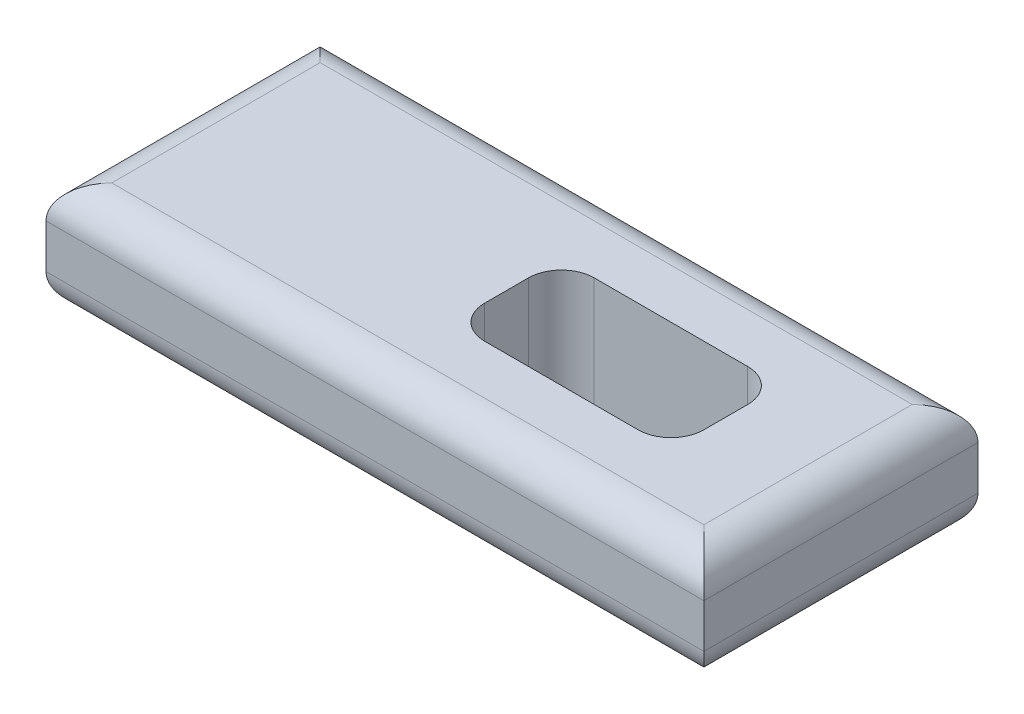
ISO-10303-21;
HEADER;
FILE_DESCRIPTION(('STEP AP214'),'2;1');
FILE_NAME('part.step','',(''),(''),'','','');
FILE_SCHEMA(('AUTOMOTIVE_DESIGN { 1 0 10303 214 1 1 1 1 }'));
ENDSEC;
DATA;
#1=APPLICATION_CONTEXT('core data for automotive mechanical design processes');
#2=APPLICATION_PROTOCOL_DEFINITION('international standard','automotive_design',2000,#1);
#3=PRODUCT_CONTEXT('',#1,'mechanical');
#4=PRODUCT('Part','Part','',(#3));
#5=PRODUCT_RELATED_PRODUCT_CATEGORY('part','',(#4));
#6=PRODUCT_DEFINITION_FORMATION('','',#4);
#7=PRODUCT_DEFINITION_CONTEXT('part definition',#1,'design');
#8=PRODUCT_DEFINITION('design','',#6,#7);
#9=PRODUCT_DEFINITION_SHAPE('','',#8);
#10=(LENGTH_UNIT() NAMED_UNIT(*) SI_UNIT(.MILLI.,.METRE.));
#11=(NAMED_UNIT(*) PLANE_ANGLE_UNIT() SI_UNIT($,.RADIAN.));
#12=(NAMED_UNIT(*) SI_UNIT($,.STERADIAN.) SOLID_ANGLE_UNIT());
#13=UNCERTAINTY_MEASURE_WITH_UNIT(LENGTH_MEASURE(1.E-05),#10,'distance_accuracy_value','');
#14=(GEOMETRIC_REPRESENTATION_CONTEXT(3) GLOBAL_UNCERTAINTY_ASSIGNED_CONTEXT((#13)) GLOBAL_UNIT_ASSIGNED_CONTEXT((#10,
#11,#12)) REPRESENTATION_CONTEXT('',''));
#15=CARTESIAN_POINT('',(0.,0.,0.));
#16=DIRECTION('',(0.,0.,1.));
#17=DIRECTION('',(1.,0.,0.));
#18=AXIS2_PLACEMENT_3D('',#15,#16,#17);
#19=CARTESIAN_POINT('',(0.,20.,0.));
#20=DIRECTION('',(1.,0.,0.));
#21=DIRECTION('',(0.,0.,-1.));
#22=AXIS2_PLACEMENT_3D('',#19,#20,#21);
#23=PLANE('',#22);
#24=DIRECTION('',(0.,-1.,0.));
#25=VECTOR('',#24,1.);
#26=CARTESIAN_POINT('',(0.,20.,-50.));
#27=LINE('',#26,#25);
#28=CARTESIAN_POINT('',(0.,14.,-50.));
#29=VERTEX_POINT('',#28);
#30=CARTESIAN_POINT('',(0.,6.,-50.));
#31=VERTEX_POINT('',#30);
#32=EDGE_CURVE('E156',#29,#31,#27,.T.);
#33=ORIENTED_EDGE('',*,*,#32,.T.);
#34=DIRECTION('',(0.,0.,1.));
#35=VECTOR('',#34,1.);
#36=CARTESIAN_POINT('',(0.,6.,0.));
#37=LINE('',#36,#35);
#38=CARTESIAN_POINT('',(0.,6.,0.));
#39=VERTEX_POINT('',#38);
#40=EDGE_CURVE('E164',#31,#39,#37,.T.);
#41=ORIENTED_EDGE('',*,*,#40,.T.);
#42=DIRECTION('',(0.,-1.,0.));
#43=VECTOR('',#42,1.);
#44=CARTESIAN_POINT('',(0.,20.,0.));
#45=LINE('',#44,#43);
#46=CARTESIAN_POINT('',(0.,14.,0.));
#47=VERTEX_POINT('',#46);
#48=EDGE_CURVE('E158',#47,#39,#45,.T.);
#49=ORIENTED_EDGE('',*,*,#48,.F.);
#50=DIRECTION('',(0.,0.,1.));
#51=VECTOR('',#50,1.);
#52=CARTESIAN_POINT('',(0.,14.,0.));
#53=LINE('',#52,#51);
#54=EDGE_CURVE('E154',#47,#29,#53,.F.);
#55=ORIENTED_EDGE('',*,*,#54,.T.);
#56=EDGE_LOOP('',(#33,#41,#49,#55));
#57=FACE_BOUND('',#56,.T.);
#58=ADVANCED_FACE('F39',(#57),#23,.F.);
#59=CARTESIAN_POINT('',(0.,20.,0.));
#60=DIRECTION('',(0.,0.,-1.));
#61=DIRECTION('',(-1.,0.,0.));
#62=AXIS2_PLACEMENT_3D('',#59,#60,#61);
#63=PLANE('',#62);
#64=ORIENTED_EDGE('',*,*,#48,.T.);
#65=DIRECTION('',(1.,0.,0.));
#66=VECTOR('',#65,1.);
#67=CARTESIAN_POINT('',(120.,6.,0.));
#68=LINE('',#67,#66);
#69=CARTESIAN_POINT('',(120.,6.,0.));
#70=VERTEX_POINT('',#69);
#71=EDGE_CURVE('E227',#39,#70,#68,.T.);
#72=ORIENTED_EDGE('',*,*,#71,.T.);
#73=DIRECTION('',(0.,-1.,0.));
#74=VECTOR('',#73,1.);
#75=CARTESIAN_POINT('',(120.,20.,0.));
#76=LINE('',#75,#74);
#77=CARTESIAN_POINT('',(120.,14.,0.));
#78=VERTEX_POINT('',#77);
#79=EDGE_CURVE('E200',#78,#70,#76,.T.);
#80=ORIENTED_EDGE('',*,*,#79,.F.);
#81=DIRECTION('',(1.,0.,0.));
#82=VECTOR('',#81,1.);
#83=CARTESIAN_POINT('',(0.,14.,0.));
#84=LINE('',#83,#82);
#85=EDGE_CURVE('E224',#78,#47,#84,.F.);
#86=ORIENTED_EDGE('',*,*,#85,.T.);
#87=EDGE_LOOP('',(#64,#72,#80,#86));
#88=FACE_BOUND('',#87,.T.);
#89=ADVANCED_FACE('F373',(#88),#63,.F.);
#90=CARTESIAN_POINT('',(120.,20.,0.));
#91=DIRECTION('',(-1.,0.,0.));
#92=DIRECTION('',(0.,0.,1.));
#93=AXIS2_PLACEMENT_3D('',#90,#91,#92);
#94=PLANE('',#93);
#95=ORIENTED_EDGE('',*,*,#79,.T.);
#96=DIRECTION('',(0.,0.,-1.));
#97=VECTOR('',#96,1.);
#98=CARTESIAN_POINT('',(120.,6.,-50.));
#99=LINE('',#98,#97);
#100=CARTESIAN_POINT('',(120.,6.,-50.));
#101=VERTEX_POINT('',#100);
#102=EDGE_CURVE('E221',#70,#101,#99,.T.);
#103=ORIENTED_EDGE('',*,*,#102,.T.);
#104=DIRECTION('',(0.,-1.,0.));
#105=VECTOR('',#104,1.);
#106=CARTESIAN_POINT('',(120.,20.,-50.));
#107=LINE('',#106,#105);
#108=CARTESIAN_POINT('',(120.,14.,-50.));
#109=VERTEX_POINT('',#108);
#110=EDGE_CURVE('E177',#109,#101,#107,.T.);
#111=ORIENTED_EDGE('',*,*,#110,.F.);
#112=DIRECTION('',(0.,0.,-1.));
#113=VECTOR('',#112,1.);
#114=CARTESIAN_POINT('',(120.,14.,0.));
#115=LINE('',#114,#113);
#116=EDGE_CURVE('E217',#109,#78,#115,.F.);
#117=ORIENTED_EDGE('',*,*,#116,.T.);
#118=EDGE_LOOP('',(#95,#103,#111,#117));
#119=FACE_BOUND('',#118,.T.);
#120=ADVANCED_FACE('F352',(#119),#94,.F.);
#121=CARTESIAN_POINT('',(0.,20.,-50.));
#122=DIRECTION('',(0.,0.,1.));
#123=DIRECTION('',(1.,0.,0.));
#124=AXIS2_PLACEMENT_3D('',#121,#122,#123);
#125=PLANE('',#124);
#126=ORIENTED_EDGE('',*,*,#110,.T.);
#127=DIRECTION('',(-1.,0.,0.));
#128=VECTOR('',#127,1.);
#129=CARTESIAN_POINT('',(0.,6.,-50.));
#130=LINE('',#129,#128);
#131=EDGE_CURVE('E175',#101,#31,#130,.T.);
#132=ORIENTED_EDGE('',*,*,#131,.T.);
#133=ORIENTED_EDGE('',*,*,#32,.F.);
#134=DIRECTION('',(-1.,0.,0.));
#135=VECTOR('',#134,1.);
#136=CARTESIAN_POINT('',(0.,14.,-50.));
#137=LINE('',#136,#135);
#138=EDGE_CURVE('E172',#29,#109,#137,.F.);
#139=ORIENTED_EDGE('',*,*,#138,.T.);
#140=EDGE_LOOP('',(#126,#132,#133,#139));
#141=FACE_BOUND('',#140,.T.);
#142=ADVANCED_FACE('F170',(#141),#125,.F.);
#143=CARTESIAN_POINT('',(0.,20.,0.));
#144=DIRECTION('',(0.,-1.,0.));
#145=DIRECTION('',(0.,0.,-1.));
#146=AXIS2_PLACEMENT_3D('',#143,#144,#145);
#147=PLANE('',#146);
#148=DIRECTION('',(1.,0.,0.));
#149=VECTOR('',#148,1.);
#150=CARTESIAN_POINT('',(59.,20.,-15.));
#151=LINE('',#150,#149);
#152=CARTESIAN_POINT('',(65.,20.,-15.));
#153=VERTEX_POINT('',#152);
#154=CARTESIAN_POINT('',(93.,20.,-15.));
#155=VERTEX_POINT('',#154);
#156=EDGE_CURVE('E324',#153,#155,#151,.T.);
#157=ORIENTED_EDGE('',*,*,#156,.F.);
#158=CARTESIAN_POINT('',(65.,20.,-21.));
#159=DIRECTION('',(0.,-1.,0.));
#160=DIRECTION('',(0.,0.,-1.));
#161=AXIS2_PLACEMENT_3D('',#158,#159,#160);
#162=CIRCLE('',#161,6.);
#163=CARTESIAN_POINT('',(59.,20.,-21.));
#164=VERTEX_POINT('',#163);
#165=EDGE_CURVE('E295',#153,#164,#162,.T.);
#166=ORIENTED_EDGE('',*,*,#165,.T.);
#167=DIRECTION('',(0.,0.,1.));
#168=VECTOR('',#167,1.);
#169=CARTESIAN_POINT('',(59.,20.,-35.));
#170=LINE('',#169,#168);
#171=CARTESIAN_POINT('',(59.,20.,-29.));
#172=VERTEX_POINT('',#171);
#173=EDGE_CURVE('E336',#172,#164,#170,.T.);
#174=ORIENTED_EDGE('',*,*,#173,.F.);
#175=CARTESIAN_POINT('',(65.,20.,-29.));
#176=DIRECTION('',(0.,-1.,0.));
#177=DIRECTION('',(0.,0.,-1.));
#178=AXIS2_PLACEMENT_3D('',#175,#176,#177);
#179=CIRCLE('',#178,6.);
#180=CARTESIAN_POINT('',(65.,20.,-35.));
#181=VERTEX_POINT('',#180);
#182=EDGE_CURVE('E301',#172,#181,#179,.T.);
#183=ORIENTED_EDGE('',*,*,#182,.T.);
#184=DIRECTION('',(-1.,0.,0.));
#185=VECTOR('',#184,1.);
#186=CARTESIAN_POINT('',(59.,20.,-35.));
#187=LINE('',#186,#185);
#188=CARTESIAN_POINT('',(93.,20.,-35.));
#189=VERTEX_POINT('',#188);
#190=EDGE_CURVE('E315',#189,#181,#187,.T.);
#191=ORIENTED_EDGE('',*,*,#190,.F.);
#192=CARTESIAN_POINT('',(93.,20.,-29.));
#193=DIRECTION('',(0.,-1.,0.));
#194=DIRECTION('',(0.,0.,-1.));
#195=AXIS2_PLACEMENT_3D('',#192,#193,#194);
#196=CIRCLE('',#195,6.);
#197=CARTESIAN_POINT('',(99.,20.,-29.));
#198=VERTEX_POINT('',#197);
#199=EDGE_CURVE('E48',#189,#198,#196,.T.);
#200=ORIENTED_EDGE('',*,*,#199,.T.);
#201=DIRECTION('',(0.,0.,-1.));
#202=VECTOR('',#201,1.);
#203=CARTESIAN_POINT('',(99.,20.,-35.));
#204=LINE('',#203,#202);
#205=CARTESIAN_POINT('',(99.,20.,-21.));
#206=VERTEX_POINT('',#205);
#207=EDGE_CURVE('E314',#206,#198,#204,.T.);
#208=ORIENTED_EDGE('',*,*,#207,.F.);
#209=CARTESIAN_POINT('',(93.,20.,-21.));
#210=DIRECTION('',(0.,-1.,0.));
#211=DIRECTION('',(0.,0.,-1.));
#212=AXIS2_PLACEMENT_3D('',#209,#210,#211);
#213=CIRCLE('',#212,6.);
#214=EDGE_CURVE('E289',#206,#155,#213,.T.);
#215=ORIENTED_EDGE('',*,*,#214,.T.);
#216=EDGE_LOOP('',(#157,#166,#174,#183,#191,#200,#208,#215));
#217=FACE_BOUND('',#216,.T.);
#218=DIRECTION('',(0.,0.,-1.));
#219=VECTOR('',#218,1.);
#220=CARTESIAN_POINT('',(114.,20.,0.));
#221=LINE('',#220,#219);
#222=CARTESIAN_POINT('',(114.,20.,-6.));
#223=VERTEX_POINT('',#222);
#224=CARTESIAN_POINT('',(114.,20.,-44.));
#225=VERTEX_POINT('',#224);
#226=EDGE_CURVE('E235',#223,#225,#221,.T.);
#227=ORIENTED_EDGE('',*,*,#226,.T.);
#228=DIRECTION('',(-1.,0.,0.));
#229=VECTOR('',#228,1.);
#230=CARTESIAN_POINT('',(0.,20.,-44.));
#231=LINE('',#230,#229);
#232=CARTESIAN_POINT('',(6.,20.,-44.));
#233=VERTEX_POINT('',#232);
#234=EDGE_CURVE('E239',#225,#233,#231,.T.);
#235=ORIENTED_EDGE('',*,*,#234,.T.);
#236=DIRECTION('',(0.,0.,1.));
#237=VECTOR('',#236,1.);
#238=CARTESIAN_POINT('',(6.,20.,0.));
#239=LINE('',#238,#237);
#240=CARTESIAN_POINT('',(6.,20.,-6.));
#241=VERTEX_POINT('',#240);
#242=EDGE_CURVE('E184',#233,#241,#239,.T.);
#243=ORIENTED_EDGE('',*,*,#242,.T.);
#244=DIRECTION('',(1.,0.,0.));
#245=VECTOR('',#244,1.);
#246=CARTESIAN_POINT('',(0.,20.,-6.));
#247=LINE('',#246,#245);
#248=EDGE_CURVE('E230',#241,#223,#247,.T.);
#249=ORIENTED_EDGE('',*,*,#248,.T.);
#250=EDGE_LOOP('',(#227,#235,#243,#249));
#251=FACE_BOUND('',#250,.T.);
#252=ADVANCED_FACE('F312',(#217,#251),#147,.F.);
#253=CARTESIAN_POINT('',(0.,0.,0.));
#254=DIRECTION('',(0.,-1.,0.));
#255=DIRECTION('',(0.,0.,-1.));
#256=AXIS2_PLACEMENT_3D('',#253,#254,#255);
#257=PLANE('',#256);
#258=DIRECTION('',(-1.,0.,0.));
#259=VECTOR('',#258,1.);
#260=CARTESIAN_POINT('',(59.,0.,-35.));
#261=LINE('',#260,#259);
#262=CARTESIAN_POINT('',(93.,0.,-35.));
#263=VERTEX_POINT('',#262);
#264=CARTESIAN_POINT('',(65.,0.,-35.));
#265=VERTEX_POINT('',#264);
#266=EDGE_CURVE('E258',#263,#265,#261,.T.);
#267=ORIENTED_EDGE('',*,*,#266,.T.);
#268=CARTESIAN_POINT('',(65.,0.,-29.));
#269=DIRECTION('',(0.,-1.,0.));
#270=DIRECTION('',(0.,0.,-1.));
#271=AXIS2_PLACEMENT_3D('',#268,#269,#270);
#272=CIRCLE('',#271,6.);
#273=CARTESIAN_POINT('',(59.,0.,-29.));
#274=VERTEX_POINT('',#273);
#275=EDGE_CURVE('E304',#265,#274,#272,.F.);
#276=ORIENTED_EDGE('',*,*,#275,.T.);
#277=DIRECTION('',(0.,0.,1.));
#278=VECTOR('',#277,1.);
#279=CARTESIAN_POINT('',(59.,0.,-35.));
#280=LINE('',#279,#278);
#281=CARTESIAN_POINT('',(59.,0.,-21.));
#282=VERTEX_POINT('',#281);
#283=EDGE_CURVE('E344',#274,#282,#280,.T.);
#284=ORIENTED_EDGE('',*,*,#283,.T.);
#285=CARTESIAN_POINT('',(65.,0.,-21.));
#286=DIRECTION('',(0.,-1.,0.));
#287=DIRECTION('',(0.,0.,-1.));
#288=AXIS2_PLACEMENT_3D('',#285,#286,#287);
#289=CIRCLE('',#288,6.);
#290=CARTESIAN_POINT('',(65.,0.,-15.));
#291=VERTEX_POINT('',#290);
#292=EDGE_CURVE('E298',#282,#291,#289,.F.);
#293=ORIENTED_EDGE('',*,*,#292,.T.);
#294=DIRECTION('',(1.,0.,0.));
#295=VECTOR('',#294,1.);
#296=CARTESIAN_POINT('',(59.,0.,-15.));
#297=LINE('',#296,#295);
#298=CARTESIAN_POINT('',(93.,0.,-15.));
#299=VERTEX_POINT('',#298);
#300=EDGE_CURVE('E332',#291,#299,#297,.T.);
#301=ORIENTED_EDGE('',*,*,#300,.T.);
#302=CARTESIAN_POINT('',(93.,0.,-21.));
#303=DIRECTION('',(0.,-1.,0.));
#304=DIRECTION('',(0.,0.,-1.));
#305=AXIS2_PLACEMENT_3D('',#302,#303,#304);
#306=CIRCLE('',#305,6.);
#307=CARTESIAN_POINT('',(99.,0.,-21.));
#308=VERTEX_POINT('',#307);
#309=EDGE_CURVE('E292',#299,#308,#306,.F.);
#310=ORIENTED_EDGE('',*,*,#309,.T.);
#311=DIRECTION('',(0.,0.,-1.));
#312=VECTOR('',#311,1.);
#313=CARTESIAN_POINT('',(99.,0.,-35.));
#314=LINE('',#313,#312);
#315=CARTESIAN_POINT('',(99.,0.,-29.));
#316=VERTEX_POINT('',#315);
#317=EDGE_CURVE('E329',#308,#316,#314,.T.);
#318=ORIENTED_EDGE('',*,*,#317,.T.);
#319=CARTESIAN_POINT('',(93.,0.,-29.));
#320=DIRECTION('',(0.,-1.,0.));
#321=DIRECTION('',(0.,0.,-1.));
#322=AXIS2_PLACEMENT_3D('',#319,#320,#321);
#323=CIRCLE('',#322,6.);
#324=EDGE_CURVE('E11',#316,#263,#323,.F.);
#325=ORIENTED_EDGE('',*,*,#324,.T.);
#326=EDGE_LOOP('',(#267,#276,#284,#293,#301,#310,#318,#325));
#327=FACE_BOUND('',#326,.T.);
#328=DIRECTION('',(0.,0.,1.));
#329=VECTOR('',#328,1.);
#330=CARTESIAN_POINT('',(6.,0.,-50.));
#331=LINE('',#330,#329);
#332=CARTESIAN_POINT('',(6.,0.,-6.));
#333=VERTEX_POINT('',#332);
#334=CARTESIAN_POINT('',(6.,0.,-44.));
#335=VERTEX_POINT('',#334);
#336=EDGE_CURVE('E209',#333,#335,#331,.F.);
#337=ORIENTED_EDGE('',*,*,#336,.T.);
#338=DIRECTION('',(-1.,0.,0.));
#339=VECTOR('',#338,1.);
#340=CARTESIAN_POINT('',(120.,0.,-44.));
#341=LINE('',#340,#339);
#342=CARTESIAN_POINT('',(114.,0.,-44.));
#343=VERTEX_POINT('',#342);
#344=EDGE_CURVE('E165',#335,#343,#341,.F.);
#345=ORIENTED_EDGE('',*,*,#344,.T.);
#346=DIRECTION('',(0.,0.,-1.));
#347=VECTOR('',#346,1.);
#348=CARTESIAN_POINT('',(114.,0.,0.));
#349=LINE('',#348,#347);
#350=CARTESIAN_POINT('',(114.,0.,-6.));
#351=VERTEX_POINT('',#350);
#352=EDGE_CURVE('E206',#343,#351,#349,.F.);
#353=ORIENTED_EDGE('',*,*,#352,.T.);
#354=DIRECTION('',(1.,0.,0.));
#355=VECTOR('',#354,1.);
#356=CARTESIAN_POINT('',(0.,0.,-6.));
#357=LINE('',#356,#355);
#358=EDGE_CURVE('E198',#351,#333,#357,.F.);
#359=ORIENTED_EDGE('',*,*,#358,.T.);
#360=EDGE_LOOP('',(#337,#345,#353,#359));
#361=FACE_BOUND('',#360,.T.);
#362=ADVANCED_FACE('F407',(#327,#361),#257,.T.);
#363=CARTESIAN_POINT('',(0.,6.,-6.));
#364=DIRECTION('',(-1.,0.,0.));
#365=DIRECTION('',(0.,0.,1.));
#366=AXIS2_PLACEMENT_3D('',#363,#364,#365);
#367=CYLINDRICAL_SURFACE('',#366,6.);
#368=CARTESIAN_POINT('',(6.,6.,-6.));
#369=DIRECTION('',(-0.707106781186547,0.,-0.707106781186547));
#370=DIRECTION('',(-0.707106781186547,0.,0.707106781186547));
#371=AXIS2_PLACEMENT_3D('',#368,#369,#370);
#372=ELLIPSE('',#371,8.48528137423857,6.);
#373=EDGE_CURVE('E249',#333,#39,#372,.T.);
#374=ORIENTED_EDGE('',*,*,#373,.F.);
#375=ORIENTED_EDGE('',*,*,#358,.F.);
#376=CARTESIAN_POINT('',(114.,6.,-6.));
#377=DIRECTION('',(-0.707106781186547,0.,0.707106781186547));
#378=DIRECTION('',(-0.707106781186547,0.,-0.707106781186547));
#379=AXIS2_PLACEMENT_3D('',#376,#377,#378);
#380=ELLIPSE('',#379,8.48528137423857,6.);
#381=EDGE_CURVE('E178',#70,#351,#380,.F.);
#382=ORIENTED_EDGE('',*,*,#381,.F.);
#383=ORIENTED_EDGE('',*,*,#71,.F.);
#384=EDGE_LOOP('',(#374,#375,#382,#383));
#385=FACE_BOUND('',#384,.T.);
#386=ADVANCED_FACE('F360',(#385),#367,.T.);
#387=CARTESIAN_POINT('',(114.,6.,0.));
#388=DIRECTION('',(0.,0.,1.));
#389=DIRECTION('',(1.,0.,0.));
#390=AXIS2_PLACEMENT_3D('',#387,#388,#389);
#391=CYLINDRICAL_SURFACE('',#390,6.);
#392=ORIENTED_EDGE('',*,*,#381,.T.);
#393=ORIENTED_EDGE('',*,*,#352,.F.);
#394=CARTESIAN_POINT('',(114.,6.,-44.));
#395=DIRECTION('',(0.707106781186547,0.,0.707106781186547));
#396=DIRECTION('',(-0.707106781186547,0.,0.707106781186547));
#397=AXIS2_PLACEMENT_3D('',#394,#395,#396);
#398=ELLIPSE('',#397,8.48528137423857,6.);
#399=EDGE_CURVE('E246',#101,#343,#398,.F.);
#400=ORIENTED_EDGE('',*,*,#399,.F.);
#401=ORIENTED_EDGE('',*,*,#102,.F.);
#402=EDGE_LOOP('',(#392,#393,#400,#401));
#403=FACE_BOUND('',#402,.T.);
#404=ADVANCED_FACE('F364',(#403),#391,.T.);
#405=CARTESIAN_POINT('',(6.,6.,0.));
#406=DIRECTION('',(0.,0.,-1.));
#407=DIRECTION('',(-1.,0.,0.));
#408=AXIS2_PLACEMENT_3D('',#405,#406,#407);
#409=CYLINDRICAL_SURFACE('',#408,6.);
#410=ORIENTED_EDGE('',*,*,#373,.T.);
#411=ORIENTED_EDGE('',*,*,#40,.F.);
#412=CARTESIAN_POINT('',(6.,6.,-44.));
#413=DIRECTION('',(0.707106781186547,0.,-0.707106781186547));
#414=DIRECTION('',(-0.707106781186547,0.,-0.707106781186547));
#415=AXIS2_PLACEMENT_3D('',#412,#413,#414);
#416=ELLIPSE('',#415,8.48528137423857,6.);
#417=EDGE_CURVE('E243',#335,#31,#416,.T.);
#418=ORIENTED_EDGE('',*,*,#417,.F.);
#419=ORIENTED_EDGE('',*,*,#336,.F.);
#420=EDGE_LOOP('',(#410,#411,#418,#419));
#421=FACE_BOUND('',#420,.T.);
#422=ADVANCED_FACE('F372',(#421),#409,.T.);
#423=CARTESIAN_POINT('',(0.,6.,-44.));
#424=DIRECTION('',(1.,0.,0.));
#425=DIRECTION('',(0.,0.,-1.));
#426=AXIS2_PLACEMENT_3D('',#423,#424,#425);
#427=CYLINDRICAL_SURFACE('',#426,6.);
#428=ORIENTED_EDGE('',*,*,#399,.T.);
#429=ORIENTED_EDGE('',*,*,#344,.F.);
#430=ORIENTED_EDGE('',*,*,#417,.T.);
#431=ORIENTED_EDGE('',*,*,#131,.F.);
#432=EDGE_LOOP('',(#428,#429,#430,#431));
#433=FACE_BOUND('',#432,.T.);
#434=ADVANCED_FACE('F367',(#433),#427,.T.);
#435=CARTESIAN_POINT('',(6.,14.,0.));
#436=DIRECTION('',(0.,0.,1.));
#437=DIRECTION('',(1.,0.,0.));
#438=AXIS2_PLACEMENT_3D('',#435,#436,#437);
#439=CYLINDRICAL_SURFACE('',#438,6.);
#440=CARTESIAN_POINT('',(6.,14.,-44.));
#441=DIRECTION('',(-0.707106781186547,0.,0.707106781186547));
#442=DIRECTION('',(-0.707106781186547,0.,-0.707106781186547));
#443=AXIS2_PLACEMENT_3D('',#440,#441,#442);
#444=ELLIPSE('',#443,8.48528137423857,6.);
#445=EDGE_CURVE('E182',#29,#233,#444,.F.);
#446=ORIENTED_EDGE('',*,*,#445,.F.);
#447=ORIENTED_EDGE('',*,*,#54,.F.);
#448=CARTESIAN_POINT('',(6.,14.,-6.));
#449=DIRECTION('',(0.707106781186547,0.,0.707106781186547));
#450=DIRECTION('',(0.707106781186547,0.,-0.707106781186547));
#451=AXIS2_PLACEMENT_3D('',#448,#449,#450);
#452=ELLIPSE('',#451,8.48528137423857,6.);
#453=EDGE_CURVE('E188',#241,#47,#452,.T.);
#454=ORIENTED_EDGE('',*,*,#453,.F.);
#455=ORIENTED_EDGE('',*,*,#242,.F.);
#456=EDGE_LOOP('',(#446,#447,#454,#455));
#457=FACE_BOUND('',#456,.T.);
#458=ADVANCED_FACE('F183',(#457),#439,.T.);
#459=CARTESIAN_POINT('',(0.,14.,-6.));
#460=DIRECTION('',(1.,0.,0.));
#461=DIRECTION('',(0.,0.,-1.));
#462=AXIS2_PLACEMENT_3D('',#459,#460,#461);
#463=CYLINDRICAL_SURFACE('',#462,6.);
#464=ORIENTED_EDGE('',*,*,#453,.T.);
#465=ORIENTED_EDGE('',*,*,#85,.F.);
#466=CARTESIAN_POINT('',(114.,14.,-6.));
#467=DIRECTION('',(0.707106781186547,0.,-0.707106781186547));
#468=DIRECTION('',(0.707106781186547,0.,0.707106781186547));
#469=AXIS2_PLACEMENT_3D('',#466,#467,#468);
#470=ELLIPSE('',#469,8.48528137423857,6.);
#471=EDGE_CURVE('E189',#223,#78,#470,.T.);
#472=ORIENTED_EDGE('',*,*,#471,.F.);
#473=ORIENTED_EDGE('',*,*,#248,.F.);
#474=EDGE_LOOP('',(#464,#465,#472,#473));
#475=FACE_BOUND('',#474,.T.);
#476=ADVANCED_FACE('F377',(#475),#463,.T.);
#477=CARTESIAN_POINT('',(0.,14.,-44.));
#478=DIRECTION('',(-1.,0.,0.));
#479=DIRECTION('',(0.,0.,1.));
#480=AXIS2_PLACEMENT_3D('',#477,#478,#479);
#481=CYLINDRICAL_SURFACE('',#480,6.);
#482=ORIENTED_EDGE('',*,*,#445,.T.);
#483=ORIENTED_EDGE('',*,*,#234,.F.);
#484=CARTESIAN_POINT('',(114.,14.,-44.));
#485=DIRECTION('',(-0.707106781186547,0.,-0.707106781186547));
#486=DIRECTION('',(-0.707106781186547,0.,0.707106781186547));
#487=AXIS2_PLACEMENT_3D('',#484,#485,#486);
#488=ELLIPSE('',#487,8.48528137423857,6.);
#489=EDGE_CURVE('E193',#109,#225,#488,.F.);
#490=ORIENTED_EDGE('',*,*,#489,.F.);
#491=ORIENTED_EDGE('',*,*,#138,.F.);
#492=EDGE_LOOP('',(#482,#483,#490,#491));
#493=FACE_BOUND('',#492,.T.);
#494=ADVANCED_FACE('F192',(#493),#481,.T.);
#495=CARTESIAN_POINT('',(114.,14.,0.));
#496=DIRECTION('',(0.,0.,-1.));
#497=DIRECTION('',(-1.,0.,0.));
#498=AXIS2_PLACEMENT_3D('',#495,#496,#497);
#499=CYLINDRICAL_SURFACE('',#498,6.);
#500=ORIENTED_EDGE('',*,*,#471,.T.);
#501=ORIENTED_EDGE('',*,*,#116,.F.);
#502=ORIENTED_EDGE('',*,*,#489,.T.);
#503=ORIENTED_EDGE('',*,*,#226,.F.);
#504=EDGE_LOOP('',(#500,#501,#502,#503));
#505=FACE_BOUND('',#504,.T.);
#506=ADVANCED_FACE('F381',(#505),#499,.T.);
#507=CARTESIAN_POINT('',(59.,0.,-35.));
#508=DIRECTION('',(-1.,0.,0.));
#509=DIRECTION('',(0.,0.,1.));
#510=AXIS2_PLACEMENT_3D('',#507,#508,#509);
#511=PLANE('',#510);
#512=ORIENTED_EDGE('',*,*,#173,.T.);
#513=DIRECTION('',(0.,1.,0.));
#514=VECTOR('',#513,1.);
#515=CARTESIAN_POINT('',(59.,0.,-21.));
#516=LINE('',#515,#514);
#517=EDGE_CURVE('E280',#164,#282,#516,.F.);
#518=ORIENTED_EDGE('',*,*,#517,.T.);
#519=ORIENTED_EDGE('',*,*,#283,.F.);
#520=DIRECTION('',(0.,1.,0.));
#521=VECTOR('',#520,1.);
#522=CARTESIAN_POINT('',(59.,20.,-29.));
#523=LINE('',#522,#521);
#524=EDGE_CURVE('E276',#274,#172,#523,.T.);
#525=ORIENTED_EDGE('',*,*,#524,.T.);
#526=EDGE_LOOP('',(#512,#518,#519,#525));
#527=FACE_BOUND('',#526,.T.);
#528=ADVANCED_FACE('F383',(#527),#511,.F.);
#529=CARTESIAN_POINT('',(59.,0.,-35.));
#530=DIRECTION('',(0.,0.,-1.));
#531=DIRECTION('',(-1.,0.,0.));
#532=AXIS2_PLACEMENT_3D('',#529,#530,#531);
#533=PLANE('',#532);
#534=ORIENTED_EDGE('',*,*,#190,.T.);
#535=DIRECTION('',(0.,1.,0.));
#536=VECTOR('',#535,1.);
#537=CARTESIAN_POINT('',(65.,0.,-35.));
#538=LINE('',#537,#536);
#539=EDGE_CURVE('E55',#181,#265,#538,.F.);
#540=ORIENTED_EDGE('',*,*,#539,.T.);
#541=ORIENTED_EDGE('',*,*,#266,.F.);
#542=DIRECTION('',(0.,1.,0.));
#543=VECTOR('',#542,1.);
#544=CARTESIAN_POINT('',(93.,20.,-35.));
#545=LINE('',#544,#543);
#546=EDGE_CURVE('E283',#263,#189,#545,.T.);
#547=ORIENTED_EDGE('',*,*,#546,.T.);
#548=EDGE_LOOP('',(#534,#540,#541,#547));
#549=FACE_BOUND('',#548,.T.);
#550=ADVANCED_FACE('F326',(#549),#533,.F.);
#551=CARTESIAN_POINT('',(99.,0.,-35.));
#552=DIRECTION('',(1.,0.,0.));
#553=DIRECTION('',(0.,0.,-1.));
#554=AXIS2_PLACEMENT_3D('',#551,#552,#553);
#555=PLANE('',#554);
#556=ORIENTED_EDGE('',*,*,#317,.F.);
#557=DIRECTION('',(0.,1.,0.));
#558=VECTOR('',#557,1.);
#559=CARTESIAN_POINT('',(99.,20.,-21.));
#560=LINE('',#559,#558);
#561=EDGE_CURVE('E265',#308,#206,#560,.T.);
#562=ORIENTED_EDGE('',*,*,#561,.T.);
#563=ORIENTED_EDGE('',*,*,#207,.T.);
#564=DIRECTION('',(0.,1.,0.));
#565=VECTOR('',#564,1.);
#566=CARTESIAN_POINT('',(99.,0.,-29.));
#567=LINE('',#566,#565);
#568=EDGE_CURVE('E242',#198,#316,#567,.F.);
#569=ORIENTED_EDGE('',*,*,#568,.T.);
#570=EDGE_LOOP('',(#556,#562,#563,#569));
#571=FACE_BOUND('',#570,.T.);
#572=ADVANCED_FACE('F321',(#571),#555,.F.);
#573=CARTESIAN_POINT('',(59.,0.,-15.));
#574=DIRECTION('',(0.,0.,1.));
#575=DIRECTION('',(1.,0.,0.));
#576=AXIS2_PLACEMENT_3D('',#573,#574,#575);
#577=PLANE('',#576);
#578=ORIENTED_EDGE('',*,*,#156,.T.);
#579=DIRECTION('',(0.,1.,0.));
#580=VECTOR('',#579,1.);
#581=CARTESIAN_POINT('',(93.,0.,-15.));
#582=LINE('',#581,#580);
#583=EDGE_CURVE('E273',#155,#299,#582,.F.);
#584=ORIENTED_EDGE('',*,*,#583,.T.);
#585=ORIENTED_EDGE('',*,*,#300,.F.);
#586=DIRECTION('',(0.,1.,0.));
#587=VECTOR('',#586,1.);
#588=CARTESIAN_POINT('',(65.,20.,-15.));
#589=LINE('',#588,#587);
#590=EDGE_CURVE('E269',#291,#153,#589,.T.);
#591=ORIENTED_EDGE('',*,*,#590,.T.);
#592=EDGE_LOOP('',(#578,#584,#585,#591));
#593=FACE_BOUND('',#592,.T.);
#594=ADVANCED_FACE('F463',(#593),#577,.F.);
#595=CARTESIAN_POINT('',(93.,0.,-21.));
#596=DIRECTION('',(0.,-1.,0.));
#597=DIRECTION('',(0.,0.,-1.));
#598=AXIS2_PLACEMENT_3D('',#595,#596,#597);
#599=CYLINDRICAL_SURFACE('',#598,6.);
#600=ORIENTED_EDGE('',*,*,#309,.F.);
#601=ORIENTED_EDGE('',*,*,#583,.F.);
#602=ORIENTED_EDGE('',*,*,#214,.F.);
#603=ORIENTED_EDGE('',*,*,#561,.F.);
#604=EDGE_LOOP('',(#600,#601,#602,#603));
#605=FACE_BOUND('',#604,.T.);
#606=ADVANCED_FACE('F472',(#605),#599,.F.);
#607=CARTESIAN_POINT('',(65.,0.,-21.));
#608=DIRECTION('',(0.,-1.,0.));
#609=DIRECTION('',(0.,0.,-1.));
#610=AXIS2_PLACEMENT_3D('',#607,#608,#609);
#611=CYLINDRICAL_SURFACE('',#610,6.);
#612=ORIENTED_EDGE('',*,*,#292,.F.);
#613=ORIENTED_EDGE('',*,*,#517,.F.);
#614=ORIENTED_EDGE('',*,*,#165,.F.);
#615=ORIENTED_EDGE('',*,*,#590,.F.);
#616=EDGE_LOOP('',(#612,#613,#614,#615));
#617=FACE_BOUND('',#616,.T.);
#618=ADVANCED_FACE('F482',(#617),#611,.F.);
#619=CARTESIAN_POINT('',(65.,0.,-29.));
#620=DIRECTION('',(0.,-1.,0.));
#621=DIRECTION('',(0.,0.,-1.));
#622=AXIS2_PLACEMENT_3D('',#619,#620,#621);
#623=CYLINDRICAL_SURFACE('',#622,6.);
#624=ORIENTED_EDGE('',*,*,#275,.F.);
#625=ORIENTED_EDGE('',*,*,#539,.F.);
#626=ORIENTED_EDGE('',*,*,#182,.F.);
#627=ORIENTED_EDGE('',*,*,#524,.F.);
#628=EDGE_LOOP('',(#624,#625,#626,#627));
#629=FACE_BOUND('',#628,.T.);
#630=ADVANCED_FACE('F492',(#629),#623,.F.);
#631=CARTESIAN_POINT('',(93.,0.,-29.));
#632=DIRECTION('',(0.,-1.,0.));
#633=DIRECTION('',(0.,0.,-1.));
#634=AXIS2_PLACEMENT_3D('',#631,#632,#633);
#635=CYLINDRICAL_SURFACE('',#634,6.);
#636=ORIENTED_EDGE('',*,*,#324,.F.);
#637=ORIENTED_EDGE('',*,*,#568,.F.);
#638=ORIENTED_EDGE('',*,*,#199,.F.);
#639=ORIENTED_EDGE('',*,*,#546,.F.);
#640=EDGE_LOOP('',(#636,#637,#638,#639));
#641=FACE_BOUND('',#640,.T.);
#642=ADVANCED_FACE('F41',(#641),#635,.F.);
#643=CLOSED_SHELL('',(#58,#89,#120,#142,#252,#362,#386,#404,#422,#434,#458,#476,#494,#506,#528,
#550,#572,#594,#606,#618,#630,#642));
#644=MANIFOLD_SOLID_BREP('B2',#643);
#645=ADVANCED_BREP_SHAPE_REPRESENTATION('',(#18,#644),#14);
#646=SHAPE_DEFINITION_REPRESENTATION(#9,#645);
ENDSEC;
END-ISO-10303-21;
